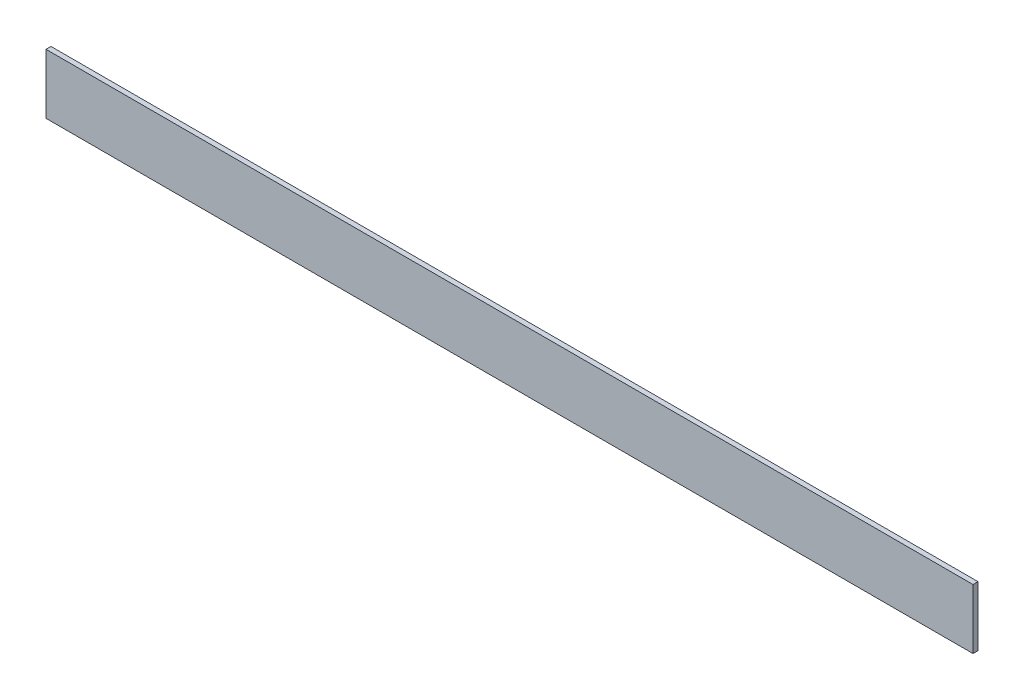
ISO-10303-21;
HEADER;
FILE_DESCRIPTION(('STEP AP214'),'2;1');
FILE_NAME('part.step','',(''),(''),'','','');
FILE_SCHEMA(('AUTOMOTIVE_DESIGN { 1 0 10303 214 1 1 1 1 }'));
ENDSEC;
DATA;
#1=APPLICATION_CONTEXT('core data for automotive mechanical design processes');
#2=APPLICATION_PROTOCOL_DEFINITION('international standard','automotive_design',2000,#1);
#3=PRODUCT_CONTEXT('',#1,'mechanical');
#4=PRODUCT('Part','Part','',(#3));
#5=PRODUCT_RELATED_PRODUCT_CATEGORY('part','',(#4));
#6=PRODUCT_DEFINITION_FORMATION('','',#4);
#7=PRODUCT_DEFINITION_CONTEXT('part definition',#1,'design');
#8=PRODUCT_DEFINITION('design','',#6,#7);
#9=PRODUCT_DEFINITION_SHAPE('','',#8);
#10=(LENGTH_UNIT() NAMED_UNIT(*) SI_UNIT(.MILLI.,.METRE.));
#11=(NAMED_UNIT(*) PLANE_ANGLE_UNIT() SI_UNIT($,.RADIAN.));
#12=(NAMED_UNIT(*) SI_UNIT($,.STERADIAN.) SOLID_ANGLE_UNIT());
#13=UNCERTAINTY_MEASURE_WITH_UNIT(LENGTH_MEASURE(1.E-05),#10,'distance_accuracy_value','');
#14=(GEOMETRIC_REPRESENTATION_CONTEXT(3) GLOBAL_UNCERTAINTY_ASSIGNED_CONTEXT((#13)) GLOBAL_UNIT_ASSIGNED_CONTEXT((#10,
#11,#12)) REPRESENTATION_CONTEXT('',''));
#15=CARTESIAN_POINT('',(0.,0.,0.));
#16=DIRECTION('',(0.,0.,1.));
#17=DIRECTION('',(1.,0.,0.));
#18=AXIS2_PLACEMENT_3D('',#15,#16,#17);
#19=CARTESIAN_POINT('',(-93.,7.,0.5));
#20=DIRECTION('',(0.,0.,1.));
#21=DIRECTION('',(1.,0.,0.));
#22=AXIS2_PLACEMENT_3D('',#19,#20,#21);
#23=PLANE('',#22);
#24=DIRECTION('',(0.,1.,0.));
#25=VECTOR('',#24,1.);
#26=CARTESIAN_POINT('',(-93.,7.,0.5));
#27=LINE('',#26,#25);
#28=CARTESIAN_POINT('',(-93.,7.,0.5));
#29=VERTEX_POINT('',#28);
#30=CARTESIAN_POINT('',(-93.,19.,0.5));
#31=VERTEX_POINT('',#30);
#32=EDGE_CURVE('E88',#29,#31,#27,.T.);
#33=ORIENTED_EDGE('',*,*,#32,.F.);
#34=DIRECTION('',(1.,0.,0.));
#35=VECTOR('',#34,1.);
#36=CARTESIAN_POINT('',(-93.,7.,0.5));
#37=LINE('',#36,#35);
#38=CARTESIAN_POINT('',(93.,7.,0.5));
#39=VERTEX_POINT('',#38);
#40=EDGE_CURVE('E107',#29,#39,#37,.T.);
#41=ORIENTED_EDGE('',*,*,#40,.T.);
#42=DIRECTION('',(0.,1.,0.));
#43=VECTOR('',#42,1.);
#44=CARTESIAN_POINT('',(93.,7.,0.5));
#45=LINE('',#44,#43);
#46=CARTESIAN_POINT('',(93.,19.,0.5));
#47=VERTEX_POINT('',#46);
#48=EDGE_CURVE('E104',#39,#47,#45,.T.);
#49=ORIENTED_EDGE('',*,*,#48,.T.);
#50=DIRECTION('',(1.,0.,0.));
#51=VECTOR('',#50,1.);
#52=CARTESIAN_POINT('',(-93.,19.,0.5));
#53=LINE('',#52,#51);
#54=EDGE_CURVE('E11',#31,#47,#53,.T.);
#55=ORIENTED_EDGE('',*,*,#54,.F.);
#56=EDGE_LOOP('',(#33,#41,#49,#55));
#57=FACE_BOUND('',#56,.T.);
#58=ADVANCED_FACE('F17',(#57),#23,.T.);
#59=CARTESIAN_POINT('',(-93.,7.,-0.5));
#60=DIRECTION('',(0.,0.,1.));
#61=DIRECTION('',(1.,0.,0.));
#62=AXIS2_PLACEMENT_3D('',#59,#60,#61);
#63=PLANE('',#62);
#64=DIRECTION('',(1.,0.,0.));
#65=VECTOR('',#64,1.);
#66=CARTESIAN_POINT('',(-93.,19.,-0.5));
#67=LINE('',#66,#65);
#68=CARTESIAN_POINT('',(-93.,19.,-0.5));
#69=VERTEX_POINT('',#68);
#70=CARTESIAN_POINT('',(93.,19.,-0.5));
#71=VERTEX_POINT('',#70);
#72=EDGE_CURVE('E26',#69,#71,#67,.T.);
#73=ORIENTED_EDGE('',*,*,#72,.T.);
#74=DIRECTION('',(0.,1.,0.));
#75=VECTOR('',#74,1.);
#76=CARTESIAN_POINT('',(93.,7.,-0.5));
#77=LINE('',#76,#75);
#78=CARTESIAN_POINT('',(93.,7.,-0.5));
#79=VERTEX_POINT('',#78);
#80=EDGE_CURVE('E99',#79,#71,#77,.T.);
#81=ORIENTED_EDGE('',*,*,#80,.F.);
#82=DIRECTION('',(1.,0.,0.));
#83=VECTOR('',#82,1.);
#84=CARTESIAN_POINT('',(-93.,7.,-0.5));
#85=LINE('',#84,#83);
#86=CARTESIAN_POINT('',(-93.,7.,-0.5));
#87=VERTEX_POINT('',#86);
#88=EDGE_CURVE('E76',#87,#79,#85,.T.);
#89=ORIENTED_EDGE('',*,*,#88,.F.);
#90=DIRECTION('',(0.,1.,0.));
#91=VECTOR('',#90,1.);
#92=CARTESIAN_POINT('',(-93.,7.,-0.5));
#93=LINE('',#92,#91);
#94=EDGE_CURVE('E79',#87,#69,#93,.T.);
#95=ORIENTED_EDGE('',*,*,#94,.T.);
#96=EDGE_LOOP('',(#73,#81,#89,#95));
#97=FACE_BOUND('',#96,.T.);
#98=ADVANCED_FACE('F19',(#97),#63,.F.);
#99=CARTESIAN_POINT('',(-93.,19.,-0.5));
#100=DIRECTION('',(0.,1.,0.));
#101=DIRECTION('',(1.,0.,0.));
#102=AXIS2_PLACEMENT_3D('',#99,#100,#101);
#103=PLANE('',#102);
#104=ORIENTED_EDGE('',*,*,#72,.F.);
#105=DIRECTION('',(0.,0.,1.));
#106=VECTOR('',#105,1.);
#107=CARTESIAN_POINT('',(-93.,19.,-0.5));
#108=LINE('',#107,#106);
#109=EDGE_CURVE('E70',#69,#31,#108,.T.);
#110=ORIENTED_EDGE('',*,*,#109,.T.);
#111=ORIENTED_EDGE('',*,*,#54,.T.);
#112=DIRECTION('',(0.,0.,1.));
#113=VECTOR('',#112,1.);
#114=CARTESIAN_POINT('',(93.,19.,-0.5));
#115=LINE('',#114,#113);
#116=EDGE_CURVE('E73',#71,#47,#115,.T.);
#117=ORIENTED_EDGE('',*,*,#116,.F.);
#118=EDGE_LOOP('',(#104,#110,#111,#117));
#119=FACE_BOUND('',#118,.T.);
#120=ADVANCED_FACE('F68',(#119),#103,.T.);
#121=CARTESIAN_POINT('',(-93.,7.,-0.5));
#122=DIRECTION('',(0.,1.,0.));
#123=DIRECTION('',(1.,0.,0.));
#124=AXIS2_PLACEMENT_3D('',#121,#122,#123);
#125=PLANE('',#124);
#126=DIRECTION('',(0.,0.,1.));
#127=VECTOR('',#126,1.);
#128=CARTESIAN_POINT('',(93.,7.,-0.5));
#129=LINE('',#128,#127);
#130=EDGE_CURVE('E97',#79,#39,#129,.T.);
#131=ORIENTED_EDGE('',*,*,#130,.T.);
#132=ORIENTED_EDGE('',*,*,#40,.F.);
#133=DIRECTION('',(0.,0.,1.));
#134=VECTOR('',#133,1.);
#135=CARTESIAN_POINT('',(-93.,7.,-0.5));
#136=LINE('',#135,#134);
#137=EDGE_CURVE('E84',#87,#29,#136,.T.);
#138=ORIENTED_EDGE('',*,*,#137,.F.);
#139=ORIENTED_EDGE('',*,*,#88,.T.);
#140=EDGE_LOOP('',(#131,#132,#138,#139));
#141=FACE_BOUND('',#140,.T.);
#142=ADVANCED_FACE('F113',(#141),#125,.F.);
#143=CARTESIAN_POINT('',(93.,7.,-0.5));
#144=DIRECTION('',(1.,0.,0.));
#145=DIRECTION('',(0.,1.,0.));
#146=AXIS2_PLACEMENT_3D('',#143,#144,#145);
#147=PLANE('',#146);
#148=ORIENTED_EDGE('',*,*,#130,.F.);
#149=ORIENTED_EDGE('',*,*,#80,.T.);
#150=ORIENTED_EDGE('',*,*,#116,.T.);
#151=ORIENTED_EDGE('',*,*,#48,.F.);
#152=EDGE_LOOP('',(#148,#149,#150,#151));
#153=FACE_BOUND('',#152,.T.);
#154=ADVANCED_FACE('F117',(#153),#147,.T.);
#155=CARTESIAN_POINT('',(-93.,7.,-0.5));
#156=DIRECTION('',(1.,0.,0.));
#157=DIRECTION('',(0.,1.,0.));
#158=AXIS2_PLACEMENT_3D('',#155,#156,#157);
#159=PLANE('',#158);
#160=ORIENTED_EDGE('',*,*,#32,.T.);
#161=ORIENTED_EDGE('',*,*,#109,.F.);
#162=ORIENTED_EDGE('',*,*,#94,.F.);
#163=ORIENTED_EDGE('',*,*,#137,.T.);
#164=EDGE_LOOP('',(#160,#161,#162,#163));
#165=FACE_BOUND('',#164,.T.);
#166=ADVANCED_FACE('F86',(#165),#159,.F.);
#167=CLOSED_SHELL('',(#58,#98,#120,#142,#154,#166));
#168=MANIFOLD_SOLID_BREP('B1',#167);
#169=ADVANCED_BREP_SHAPE_REPRESENTATION('',(#18,#168),#14);
#170=SHAPE_DEFINITION_REPRESENTATION(#9,#169);
ENDSEC;
END-ISO-10303-21;
